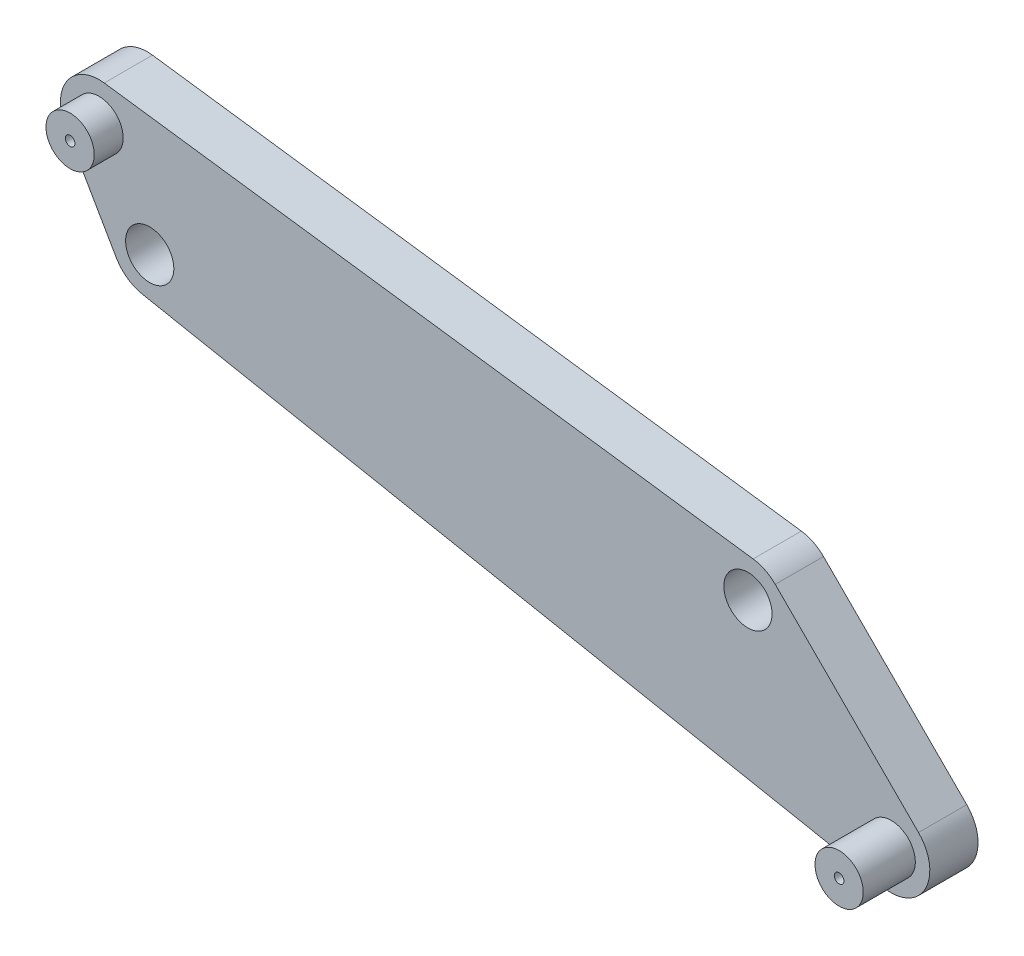
ISO-10303-21;
HEADER;
FILE_DESCRIPTION(('STEP AP214'),'2;1');
FILE_NAME('part.step','',(''),(''),'','','');
FILE_SCHEMA(('AUTOMOTIVE_DESIGN { 1 0 10303 214 1 1 1 1 }'));
ENDSEC;
DATA;
#1=APPLICATION_CONTEXT('core data for automotive mechanical design processes');
#2=APPLICATION_PROTOCOL_DEFINITION('international standard','automotive_design',2000,#1);
#3=PRODUCT_CONTEXT('',#1,'mechanical');
#4=PRODUCT('Part','Part','',(#3));
#5=PRODUCT_RELATED_PRODUCT_CATEGORY('part','',(#4));
#6=PRODUCT_DEFINITION_FORMATION('','',#4);
#7=PRODUCT_DEFINITION_CONTEXT('part definition',#1,'design');
#8=PRODUCT_DEFINITION('design','',#6,#7);
#9=PRODUCT_DEFINITION_SHAPE('','',#8);
#10=(LENGTH_UNIT() NAMED_UNIT(*) SI_UNIT(.MILLI.,.METRE.));
#11=(NAMED_UNIT(*) PLANE_ANGLE_UNIT() SI_UNIT($,.RADIAN.));
#12=(NAMED_UNIT(*) SI_UNIT($,.STERADIAN.) SOLID_ANGLE_UNIT());
#13=UNCERTAINTY_MEASURE_WITH_UNIT(LENGTH_MEASURE(1.E-05),#10,'distance_accuracy_value','');
#14=(GEOMETRIC_REPRESENTATION_CONTEXT(3) GLOBAL_UNCERTAINTY_ASSIGNED_CONTEXT((#13)) GLOBAL_UNIT_ASSIGNED_CONTEXT((#10,
#11,#12)) REPRESENTATION_CONTEXT('',''));
#15=CARTESIAN_POINT('',(0.,0.,0.));
#16=DIRECTION('',(0.,0.,1.));
#17=DIRECTION('',(1.,0.,0.));
#18=AXIS2_PLACEMENT_3D('',#15,#16,#17);
#19=CARTESIAN_POINT('',(-62.,0.,5.));
#20=DIRECTION('',(0.,0.,1.));
#21=DIRECTION('',(1.,0.,0.));
#22=AXIS2_PLACEMENT_3D('',#19,#20,#21);
#23=PLANE('',#22);
#24=CARTESIAN_POINT('',(0.,0.,5.));
#25=DIRECTION('',(0.,0.,1.));
#26=DIRECTION('',(1.,0.,0.));
#27=AXIS2_PLACEMENT_3D('',#24,#25,#26);
#28=CIRCLE('',#27,2.5);
#29=CARTESIAN_POINT('',(2.5,0.,5.));
#30=VERTEX_POINT('',#29);
#31=EDGE_CURVE('E188',#30,#30,#28,.T.);
#32=ORIENTED_EDGE('',*,*,#31,.F.);
#33=EDGE_LOOP('',(#32));
#34=FACE_BOUND('',#33,.T.);
#35=CARTESIAN_POINT('',(-62.,0.,5.));
#36=DIRECTION('',(0.,0.,1.));
#37=DIRECTION('',(1.,0.,0.));
#38=AXIS2_PLACEMENT_3D('',#35,#36,#37);
#39=CIRCLE('',#38,2.5);
#40=CARTESIAN_POINT('',(-59.5,0.,5.));
#41=VERTEX_POINT('',#40);
#42=EDGE_CURVE('E135',#41,#41,#39,.T.);
#43=ORIENTED_EDGE('',*,*,#42,.F.);
#44=EDGE_LOOP('',(#43));
#45=FACE_BOUND('',#44,.T.);
#46=CARTESIAN_POINT('',(-62.,0.,5.));
#47=DIRECTION('',(0.,0.,1.));
#48=DIRECTION('',(1.,0.,0.));
#49=AXIS2_PLACEMENT_3D('',#46,#47,#48);
#50=CIRCLE('',#49,3.99999999999999);
#51=CARTESIAN_POINT('',(-65.4641016151377,-1.99999999999999,5.));
#52=VERTEX_POINT('',#51);
#53=CARTESIAN_POINT('',(-62.7588657347675,-3.92735570028943,5.));
#54=VERTEX_POINT('',#53);
#55=EDGE_CURVE('E146',#52,#54,#50,.T.);
#56=ORIENTED_EDGE('',*,*,#55,.T.);
#57=DIRECTION('',(0.981838925072355,-0.189716433691869,0.));
#58=VECTOR('',#57,1.);
#59=CARTESIAN_POINT('',(14.0903766701501,-18.7765981052068,5.));
#60=LINE('',#59,#58);
#61=CARTESIAN_POINT('',(14.0903766701501,-18.7765981052068,5.));
#62=VERTEX_POINT('',#61);
#63=EDGE_CURVE('E94',#54,#62,#60,.T.);
#64=ORIENTED_EDGE('',*,*,#63,.T.);
#65=CARTESIAN_POINT('',(14.8492424049176,-14.8492424049174,5.));
#66=DIRECTION('',(0.,0.,1.));
#67=DIRECTION('',(1.,0.,0.));
#68=AXIS2_PLACEMENT_3D('',#65,#66,#67);
#69=CIRCLE('',#68,4.);
#70=CARTESIAN_POINT('',(17.6776695296638,-12.0208152801712,5.));
#71=VERTEX_POINT('',#70);
#72=EDGE_CURVE('E161',#62,#71,#69,.T.);
#73=ORIENTED_EDGE('',*,*,#72,.T.);
#74=DIRECTION('',(-0.707106781186551,0.707106781186543,0.));
#75=VECTOR('',#74,1.);
#76=CARTESIAN_POINT('',(2.82842712474617,2.82842712474621,5.));
#77=LINE('',#76,#75);
#78=CARTESIAN_POINT('',(2.82842712474617,2.82842712474621,5.));
#79=VERTEX_POINT('',#78);
#80=EDGE_CURVE('E174',#71,#79,#77,.T.);
#81=ORIENTED_EDGE('',*,*,#80,.T.);
#82=CARTESIAN_POINT('',(0.,0.,5.));
#83=DIRECTION('',(0.,0.,1.));
#84=DIRECTION('',(1.,0.,0.));
#85=AXIS2_PLACEMENT_3D('',#82,#83,#84);
#86=CIRCLE('',#85,4.);
#87=CARTESIAN_POINT('',(0.535985840113661,3.96392724191523,5.));
#88=VERTEX_POINT('',#87);
#89=EDGE_CURVE('E113',#79,#88,#86,.T.);
#90=ORIENTED_EDGE('',*,*,#89,.T.);
#91=DIRECTION('',(-0.990981810478807,0.133996460028415,0.));
#92=VECTOR('',#91,1.);
#93=CARTESIAN_POINT('',(-66.7140141598863,13.0571939816518,5.));
#94=LINE('',#93,#92);
#95=CARTESIAN_POINT('',(-66.7140141598863,13.0571939816518,5.));
#96=VERTEX_POINT('',#95);
#97=EDGE_CURVE('E107',#88,#96,#94,.T.);
#98=ORIENTED_EDGE('',*,*,#97,.T.);
#99=CARTESIAN_POINT('',(-67.25,9.09326673973662,5.));
#100=DIRECTION('',(0.,0.,1.));
#101=DIRECTION('',(1.,0.,0.));
#102=AXIS2_PLACEMENT_3D('',#99,#100,#101);
#103=CIRCLE('',#102,4.);
#104=CARTESIAN_POINT('',(-70.7141016151377,7.09326673973663,5.));
#105=VERTEX_POINT('',#104);
#106=EDGE_CURVE('E111',#96,#105,#103,.T.);
#107=ORIENTED_EDGE('',*,*,#106,.T.);
#108=DIRECTION('',(0.499999999999997,-0.866025403784441,0.));
#109=VECTOR('',#108,1.);
#110=CARTESIAN_POINT('',(-65.4641016151377,-1.99999999999999,5.));
#111=LINE('',#110,#109);
#112=EDGE_CURVE('E51',#105,#52,#111,.T.);
#113=ORIENTED_EDGE('',*,*,#112,.T.);
#114=EDGE_LOOP('',(#56,#64,#73,#81,#90,#98,#107,#113));
#115=FACE_BOUND('',#114,.T.);
#116=CARTESIAN_POINT('',(-67.25,9.09326673973662,5.));
#117=DIRECTION('',(0.,0.,1.));
#118=DIRECTION('',(1.,0.,0.));
#119=AXIS2_PLACEMENT_3D('',#116,#117,#118);
#120=CIRCLE('',#119,2.50000000000001);
#121=CARTESIAN_POINT('',(-64.7499999999999,9.09326673973662,5.));
#122=VERTEX_POINT('',#121);
#123=EDGE_CURVE('E183',#122,#122,#120,.T.);
#124=ORIENTED_EDGE('',*,*,#123,.F.);
#125=EDGE_LOOP('',(#124));
#126=FACE_BOUND('',#125,.T.);
#127=CARTESIAN_POINT('',(14.8492424049176,-14.8492424049174,5.));
#128=DIRECTION('',(0.,0.,1.));
#129=DIRECTION('',(1.,0.,0.));
#130=AXIS2_PLACEMENT_3D('',#127,#128,#129);
#131=CIRCLE('',#130,2.5);
#132=CARTESIAN_POINT('',(17.3492424049176,-14.8492424049174,5.));
#133=VERTEX_POINT('',#132);
#134=EDGE_CURVE('E192',#133,#133,#131,.T.);
#135=ORIENTED_EDGE('',*,*,#134,.F.);
#136=EDGE_LOOP('',(#135));
#137=FACE_BOUND('',#136,.T.);
#138=ADVANCED_FACE('F34',(#34,#45,#115,#126,#137),#23,.T.);
#139=CARTESIAN_POINT('',(-62.,0.,0.));
#140=DIRECTION('',(0.,0.,1.));
#141=DIRECTION('',(1.,0.,0.));
#142=AXIS2_PLACEMENT_3D('',#139,#140,#141);
#143=PLANE('',#142);
#144=CARTESIAN_POINT('',(-62.,0.,0.));
#145=DIRECTION('',(0.,0.,1.));
#146=DIRECTION('',(1.,0.,0.));
#147=AXIS2_PLACEMENT_3D('',#144,#145,#146);
#148=CIRCLE('',#147,3.99999999999999);
#149=CARTESIAN_POINT('',(-65.4641016151377,-1.99999999999999,0.));
#150=VERTEX_POINT('',#149);
#151=CARTESIAN_POINT('',(-62.7588657347675,-3.92735570028943,0.));
#152=VERTEX_POINT('',#151);
#153=EDGE_CURVE('E131',#150,#152,#148,.T.);
#154=ORIENTED_EDGE('',*,*,#153,.F.);
#155=DIRECTION('',(0.499999999999997,-0.866025403784441,0.));
#156=VECTOR('',#155,1.);
#157=CARTESIAN_POINT('',(-65.4641016151377,-1.99999999999999,0.));
#158=LINE('',#157,#156);
#159=CARTESIAN_POINT('',(-70.7141016151377,7.09326673973663,0.));
#160=VERTEX_POINT('',#159);
#161=EDGE_CURVE('E86',#160,#150,#158,.T.);
#162=ORIENTED_EDGE('',*,*,#161,.F.);
#163=CARTESIAN_POINT('',(-67.25,9.09326673973662,0.));
#164=DIRECTION('',(0.,0.,1.));
#165=DIRECTION('',(1.,0.,0.));
#166=AXIS2_PLACEMENT_3D('',#163,#164,#165);
#167=CIRCLE('',#166,4.);
#168=CARTESIAN_POINT('',(-66.7140141598863,13.0571939816518,0.));
#169=VERTEX_POINT('',#168);
#170=EDGE_CURVE('E80',#169,#160,#167,.T.);
#171=ORIENTED_EDGE('',*,*,#170,.F.);
#172=DIRECTION('',(-0.990981810478807,0.133996460028415,0.));
#173=VECTOR('',#172,1.);
#174=CARTESIAN_POINT('',(-66.7140141598863,13.0571939816518,0.));
#175=LINE('',#174,#173);
#176=CARTESIAN_POINT('',(0.535985840113661,3.96392724191523,0.));
#177=VERTEX_POINT('',#176);
#178=EDGE_CURVE('E121',#177,#169,#175,.T.);
#179=ORIENTED_EDGE('',*,*,#178,.F.);
#180=CARTESIAN_POINT('',(0.,0.,0.));
#181=DIRECTION('',(0.,0.,1.));
#182=DIRECTION('',(1.,0.,0.));
#183=AXIS2_PLACEMENT_3D('',#180,#181,#182);
#184=CIRCLE('',#183,4.);
#185=CARTESIAN_POINT('',(2.82842712474617,2.82842712474621,0.));
#186=VERTEX_POINT('',#185);
#187=EDGE_CURVE('E141',#186,#177,#184,.T.);
#188=ORIENTED_EDGE('',*,*,#187,.F.);
#189=DIRECTION('',(-0.707106781186551,0.707106781186543,0.));
#190=VECTOR('',#189,1.);
#191=CARTESIAN_POINT('',(2.82842712474617,2.82842712474621,0.));
#192=LINE('',#191,#190);
#193=CARTESIAN_POINT('',(17.6776695296638,-12.0208152801712,0.));
#194=VERTEX_POINT('',#193);
#195=EDGE_CURVE('E139',#194,#186,#192,.T.);
#196=ORIENTED_EDGE('',*,*,#195,.F.);
#197=CARTESIAN_POINT('',(14.8492424049176,-14.8492424049174,0.));
#198=DIRECTION('',(0.,0.,1.));
#199=DIRECTION('',(1.,0.,0.));
#200=AXIS2_PLACEMENT_3D('',#197,#198,#199);
#201=CIRCLE('',#200,4.);
#202=CARTESIAN_POINT('',(14.0903766701501,-18.7765981052068,0.));
#203=VERTEX_POINT('',#202);
#204=EDGE_CURVE('E137',#203,#194,#201,.T.);
#205=ORIENTED_EDGE('',*,*,#204,.F.);
#206=DIRECTION('',(0.981838925072355,-0.189716433691869,0.));
#207=VECTOR('',#206,1.);
#208=CARTESIAN_POINT('',(14.0903766701501,-18.7765981052068,0.));
#209=LINE('',#208,#207);
#210=EDGE_CURVE('E134',#152,#203,#209,.T.);
#211=ORIENTED_EDGE('',*,*,#210,.F.);
#212=EDGE_LOOP('',(#154,#162,#171,#179,#188,#196,#205,#211));
#213=FACE_BOUND('',#212,.T.);
#214=CARTESIAN_POINT('',(-62.,0.,0.));
#215=DIRECTION('',(0.,0.,1.));
#216=DIRECTION('',(1.,0.,0.));
#217=AXIS2_PLACEMENT_3D('',#214,#215,#216);
#218=CIRCLE('',#217,2.5);
#219=CARTESIAN_POINT('',(-59.5,0.,0.));
#220=VERTEX_POINT('',#219);
#221=EDGE_CURVE('E180',#220,#220,#218,.T.);
#222=ORIENTED_EDGE('',*,*,#221,.T.);
#223=EDGE_LOOP('',(#222));
#224=FACE_BOUND('',#223,.T.);
#225=CARTESIAN_POINT('',(0.,0.,0.));
#226=DIRECTION('',(0.,0.,1.));
#227=DIRECTION('',(1.,0.,0.));
#228=AXIS2_PLACEMENT_3D('',#225,#226,#227);
#229=CIRCLE('',#228,2.5);
#230=CARTESIAN_POINT('',(2.5,0.,0.));
#231=VERTEX_POINT('',#230);
#232=EDGE_CURVE('E189',#231,#231,#229,.T.);
#233=ORIENTED_EDGE('',*,*,#232,.T.);
#234=EDGE_LOOP('',(#233));
#235=FACE_BOUND('',#234,.T.);
#236=CARTESIAN_POINT('',(-67.25,9.09326673973662,0.));
#237=DIRECTION('',(0.,0.,-1.));
#238=DIRECTION('',(-1.,0.,0.));
#239=AXIS2_PLACEMENT_3D('',#236,#237,#238);
#240=CIRCLE('',#239,0.499999999999999);
#241=CARTESIAN_POINT('',(-67.75,9.09326673973662,0.));
#242=VERTEX_POINT('',#241);
#243=EDGE_CURVE('E201',#242,#242,#240,.T.);
#244=ORIENTED_EDGE('',*,*,#243,.F.);
#245=EDGE_LOOP('',(#244));
#246=FACE_BOUND('',#245,.T.);
#247=CARTESIAN_POINT('',(14.8492424049176,-14.8492424049174,0.));
#248=DIRECTION('',(0.,0.,-1.));
#249=DIRECTION('',(-1.,0.,0.));
#250=AXIS2_PLACEMENT_3D('',#247,#248,#249);
#251=CIRCLE('',#250,0.500000000000001);
#252=CARTESIAN_POINT('',(14.3492424049176,-14.8492424049174,0.));
#253=VERTEX_POINT('',#252);
#254=EDGE_CURVE('E204',#253,#253,#251,.T.);
#255=ORIENTED_EDGE('',*,*,#254,.F.);
#256=EDGE_LOOP('',(#255));
#257=FACE_BOUND('',#256,.T.);
#258=ADVANCED_FACE('F165',(#213,#224,#235,#246,#257),#143,.F.);
#259=CARTESIAN_POINT('',(-62.,0.,5.));
#260=DIRECTION('',(0.,0.,-1.));
#261=DIRECTION('',(-1.,0.,0.));
#262=AXIS2_PLACEMENT_3D('',#259,#260,#261);
#263=CYLINDRICAL_SURFACE('',#262,3.99999999999999);
#264=ORIENTED_EDGE('',*,*,#153,.T.);
#265=DIRECTION('',(0.,0.,-1.));
#266=VECTOR('',#265,1.);
#267=CARTESIAN_POINT('',(-62.7588657347675,-3.92735570028943,5.));
#268=LINE('',#267,#266);
#269=EDGE_CURVE('E11',#54,#152,#268,.T.);
#270=ORIENTED_EDGE('',*,*,#269,.F.);
#271=ORIENTED_EDGE('',*,*,#55,.F.);
#272=DIRECTION('',(0.,0.,-1.));
#273=VECTOR('',#272,1.);
#274=CARTESIAN_POINT('',(-65.4641016151377,-1.99999999999999,5.));
#275=LINE('',#274,#273);
#276=EDGE_CURVE('E127',#52,#150,#275,.T.);
#277=ORIENTED_EDGE('',*,*,#276,.T.);
#278=EDGE_LOOP('',(#264,#270,#271,#277));
#279=FACE_BOUND('',#278,.T.);
#280=ADVANCED_FACE('F36',(#279),#263,.T.);
#281=CARTESIAN_POINT('',(14.0903766701501,-18.7765981052068,5.));
#282=DIRECTION('',(0.189716433691869,0.981838925072355,0.));
#283=DIRECTION('',(-0.981838925072356,0.189716433691869,0.));
#284=AXIS2_PLACEMENT_3D('',#281,#282,#283);
#285=PLANE('',#284);
#286=ORIENTED_EDGE('',*,*,#210,.T.);
#287=DIRECTION('',(0.,0.,-1.));
#288=VECTOR('',#287,1.);
#289=CARTESIAN_POINT('',(14.0903766701501,-18.7765981052068,5.));
#290=LINE('',#289,#288);
#291=EDGE_CURVE('E43',#62,#203,#290,.T.);
#292=ORIENTED_EDGE('',*,*,#291,.F.);
#293=ORIENTED_EDGE('',*,*,#63,.F.);
#294=ORIENTED_EDGE('',*,*,#269,.T.);
#295=EDGE_LOOP('',(#286,#292,#293,#294));
#296=FACE_BOUND('',#295,.T.);
#297=ADVANCED_FACE('F253',(#296),#285,.F.);
#298=CARTESIAN_POINT('',(14.8492424049176,-14.8492424049174,5.));
#299=DIRECTION('',(0.,0.,-1.));
#300=DIRECTION('',(-1.,0.,0.));
#301=AXIS2_PLACEMENT_3D('',#298,#299,#300);
#302=CYLINDRICAL_SURFACE('',#301,4.);
#303=ORIENTED_EDGE('',*,*,#204,.T.);
#304=DIRECTION('',(0.,0.,-1.));
#305=VECTOR('',#304,1.);
#306=CARTESIAN_POINT('',(17.6776695296638,-12.0208152801712,5.));
#307=LINE('',#306,#305);
#308=EDGE_CURVE('E153',#71,#194,#307,.T.);
#309=ORIENTED_EDGE('',*,*,#308,.F.);
#310=ORIENTED_EDGE('',*,*,#72,.F.);
#311=ORIENTED_EDGE('',*,*,#291,.T.);
#312=EDGE_LOOP('',(#303,#309,#310,#311));
#313=FACE_BOUND('',#312,.T.);
#314=ADVANCED_FACE('F159',(#313),#302,.T.);
#315=CARTESIAN_POINT('',(2.82842712474617,2.82842712474621,5.));
#316=DIRECTION('',(-0.707106781186544,-0.707106781186551,0.));
#317=DIRECTION('',(0.707106781186551,-0.707106781186544,0.));
#318=AXIS2_PLACEMENT_3D('',#315,#316,#317);
#319=PLANE('',#318);
#320=ORIENTED_EDGE('',*,*,#195,.T.);
#321=DIRECTION('',(0.,0.,-1.));
#322=VECTOR('',#321,1.);
#323=CARTESIAN_POINT('',(2.82842712474617,2.82842712474621,5.));
#324=LINE('',#323,#322);
#325=EDGE_CURVE('E150',#79,#186,#324,.T.);
#326=ORIENTED_EDGE('',*,*,#325,.F.);
#327=ORIENTED_EDGE('',*,*,#80,.F.);
#328=ORIENTED_EDGE('',*,*,#308,.T.);
#329=EDGE_LOOP('',(#320,#326,#327,#328));
#330=FACE_BOUND('',#329,.T.);
#331=ADVANCED_FACE('F170',(#330),#319,.F.);
#332=CARTESIAN_POINT('',(0.,0.,5.));
#333=DIRECTION('',(0.,0.,-1.));
#334=DIRECTION('',(-1.,0.,0.));
#335=AXIS2_PLACEMENT_3D('',#332,#333,#334);
#336=CYLINDRICAL_SURFACE('',#335,4.);
#337=ORIENTED_EDGE('',*,*,#187,.T.);
#338=DIRECTION('',(0.,0.,-1.));
#339=VECTOR('',#338,1.);
#340=CARTESIAN_POINT('',(0.535985840113661,3.96392724191523,5.));
#341=LINE('',#340,#339);
#342=EDGE_CURVE('E122',#88,#177,#341,.T.);
#343=ORIENTED_EDGE('',*,*,#342,.F.);
#344=ORIENTED_EDGE('',*,*,#89,.F.);
#345=ORIENTED_EDGE('',*,*,#325,.T.);
#346=EDGE_LOOP('',(#337,#343,#344,#345));
#347=FACE_BOUND('',#346,.T.);
#348=ADVANCED_FACE('F173',(#347),#336,.T.);
#349=CARTESIAN_POINT('',(-66.7140141598863,13.0571939816518,5.));
#350=DIRECTION('',(-0.133996460028415,-0.990981810478807,0.));
#351=DIRECTION('',(0.990981810478807,-0.133996460028415,0.));
#352=AXIS2_PLACEMENT_3D('',#349,#350,#351);
#353=PLANE('',#352);
#354=ORIENTED_EDGE('',*,*,#178,.T.);
#355=DIRECTION('',(0.,0.,-1.));
#356=VECTOR('',#355,1.);
#357=CARTESIAN_POINT('',(-66.7140141598863,13.0571939816518,5.));
#358=LINE('',#357,#356);
#359=EDGE_CURVE('E118',#96,#169,#358,.T.);
#360=ORIENTED_EDGE('',*,*,#359,.F.);
#361=ORIENTED_EDGE('',*,*,#97,.F.);
#362=ORIENTED_EDGE('',*,*,#342,.T.);
#363=EDGE_LOOP('',(#354,#360,#361,#362));
#364=FACE_BOUND('',#363,.T.);
#365=ADVANCED_FACE('F119',(#364),#353,.F.);
#366=CARTESIAN_POINT('',(-67.25,9.09326673973662,5.));
#367=DIRECTION('',(0.,0.,-1.));
#368=DIRECTION('',(-1.,0.,0.));
#369=AXIS2_PLACEMENT_3D('',#366,#367,#368);
#370=CYLINDRICAL_SURFACE('',#369,4.);
#371=ORIENTED_EDGE('',*,*,#170,.T.);
#372=DIRECTION('',(0.,0.,-1.));
#373=VECTOR('',#372,1.);
#374=CARTESIAN_POINT('',(-70.7141016151377,7.09326673973663,5.));
#375=LINE('',#374,#373);
#376=EDGE_CURVE('E123',#105,#160,#375,.T.);
#377=ORIENTED_EDGE('',*,*,#376,.F.);
#378=ORIENTED_EDGE('',*,*,#106,.F.);
#379=ORIENTED_EDGE('',*,*,#359,.T.);
#380=EDGE_LOOP('',(#371,#377,#378,#379));
#381=FACE_BOUND('',#380,.T.);
#382=ADVANCED_FACE('F125',(#381),#370,.T.);
#383=CARTESIAN_POINT('',(-65.4641016151377,-1.99999999999999,5.));
#384=DIRECTION('',(0.866025403784441,0.499999999999997,0.));
#385=DIRECTION('',(-0.499999999999997,0.866025403784441,0.));
#386=AXIS2_PLACEMENT_3D('',#383,#384,#385);
#387=PLANE('',#386);
#388=ORIENTED_EDGE('',*,*,#161,.T.);
#389=ORIENTED_EDGE('',*,*,#276,.F.);
#390=ORIENTED_EDGE('',*,*,#112,.F.);
#391=ORIENTED_EDGE('',*,*,#376,.T.);
#392=EDGE_LOOP('',(#388,#389,#390,#391));
#393=FACE_BOUND('',#392,.T.);
#394=ADVANCED_FACE('F241',(#393),#387,.F.);
#395=CARTESIAN_POINT('',(-62.,0.,5.));
#396=DIRECTION('',(0.,0.,-1.));
#397=DIRECTION('',(-1.,0.,0.));
#398=AXIS2_PLACEMENT_3D('',#395,#396,#397);
#399=CYLINDRICAL_SURFACE('',#398,2.5);
#400=ORIENTED_EDGE('',*,*,#42,.T.);
#401=EDGE_LOOP('',(#400));
#402=FACE_BOUND('',#401,.T.);
#403=ORIENTED_EDGE('',*,*,#221,.F.);
#404=EDGE_LOOP('',(#403));
#405=FACE_BOUND('',#404,.T.);
#406=ADVANCED_FACE('F238',(#402,#405),#399,.F.);
#407=CARTESIAN_POINT('',(0.,0.,5.));
#408=DIRECTION('',(0.,0.,-1.));
#409=DIRECTION('',(-1.,0.,0.));
#410=AXIS2_PLACEMENT_3D('',#407,#408,#409);
#411=CYLINDRICAL_SURFACE('',#410,2.5);
#412=ORIENTED_EDGE('',*,*,#31,.T.);
#413=EDGE_LOOP('',(#412));
#414=FACE_BOUND('',#413,.T.);
#415=ORIENTED_EDGE('',*,*,#232,.F.);
#416=EDGE_LOOP('',(#415));
#417=FACE_BOUND('',#416,.T.);
#418=ADVANCED_FACE('F275',(#414,#417),#411,.F.);
#419=CARTESIAN_POINT('',(-67.25,9.09326673973662,8.));
#420=DIRECTION('',(0.,0.,-1.));
#421=DIRECTION('',(-1.,0.,0.));
#422=AXIS2_PLACEMENT_3D('',#419,#420,#421);
#423=CYLINDRICAL_SURFACE('',#422,2.50000000000001);
#424=ORIENTED_EDGE('',*,*,#123,.T.);
#425=EDGE_LOOP('',(#424));
#426=FACE_BOUND('',#425,.T.);
#427=CARTESIAN_POINT('',(-67.25,9.09326673973662,8.));
#428=DIRECTION('',(0.,0.,-1.));
#429=DIRECTION('',(-1.,0.,0.));
#430=AXIS2_PLACEMENT_3D('',#427,#428,#429);
#431=CIRCLE('',#430,2.50000000000001);
#432=CARTESIAN_POINT('',(-69.75,9.09326673973662,8.));
#433=VERTEX_POINT('',#432);
#434=EDGE_CURVE('E197',#433,#433,#431,.T.);
#435=ORIENTED_EDGE('',*,*,#434,.T.);
#436=EDGE_LOOP('',(#435));
#437=FACE_BOUND('',#436,.T.);
#438=ADVANCED_FACE('F280',(#426,#437),#423,.T.);
#439=CARTESIAN_POINT('',(-67.25,9.09326673973662,8.));
#440=DIRECTION('',(0.,0.,-1.));
#441=DIRECTION('',(-1.,0.,0.));
#442=AXIS2_PLACEMENT_3D('',#439,#440,#441);
#443=PLANE('',#442);
#444=CARTESIAN_POINT('',(-67.25,9.09326673973662,8.));
#445=DIRECTION('',(0.,0.,-1.));
#446=DIRECTION('',(-1.,0.,0.));
#447=AXIS2_PLACEMENT_3D('',#444,#445,#446);
#448=CIRCLE('',#447,0.499999999999999);
#449=CARTESIAN_POINT('',(-67.75,9.09326673973662,8.));
#450=VERTEX_POINT('',#449);
#451=EDGE_CURVE('E200',#450,#450,#448,.T.);
#452=ORIENTED_EDGE('',*,*,#451,.T.);
#453=EDGE_LOOP('',(#452));
#454=FACE_BOUND('',#453,.T.);
#455=ORIENTED_EDGE('',*,*,#434,.F.);
#456=EDGE_LOOP('',(#455));
#457=FACE_BOUND('',#456,.T.);
#458=ADVANCED_FACE('F284',(#454,#457),#443,.F.);
#459=CARTESIAN_POINT('',(-67.25,9.09326673973662,8.));
#460=DIRECTION('',(0.,0.,-1.));
#461=DIRECTION('',(-1.,0.,0.));
#462=AXIS2_PLACEMENT_3D('',#459,#460,#461);
#463=CYLINDRICAL_SURFACE('',#462,0.499999999999999);
#464=ORIENTED_EDGE('',*,*,#451,.F.);
#465=EDGE_LOOP('',(#464));
#466=FACE_BOUND('',#465,.T.);
#467=ORIENTED_EDGE('',*,*,#243,.T.);
#468=EDGE_LOOP('',(#467));
#469=FACE_BOUND('',#468,.T.);
#470=ADVANCED_FACE('F294',(#466,#469),#463,.F.);
#471=CARTESIAN_POINT('',(14.8492424049176,-14.8492424049174,8.));
#472=DIRECTION('',(0.,0.,-1.));
#473=DIRECTION('',(-1.,0.,0.));
#474=AXIS2_PLACEMENT_3D('',#471,#472,#473);
#475=CYLINDRICAL_SURFACE('',#474,2.5);
#476=ORIENTED_EDGE('',*,*,#134,.T.);
#477=EDGE_LOOP('',(#476));
#478=FACE_BOUND('',#477,.T.);
#479=CARTESIAN_POINT('',(14.8492424049176,-14.8492424049174,10.4));
#480=DIRECTION('',(0.,0.,1.));
#481=DIRECTION('',(1.,0.,0.));
#482=AXIS2_PLACEMENT_3D('',#479,#480,#481);
#483=CIRCLE('',#482,2.5);
#484=CARTESIAN_POINT('',(17.3492424049176,-14.8492424049174,10.4));
#485=VERTEX_POINT('',#484);
#486=EDGE_CURVE('E209',#485,#485,#483,.T.);
#487=ORIENTED_EDGE('',*,*,#486,.F.);
#488=EDGE_LOOP('',(#487));
#489=FACE_BOUND('',#488,.T.);
#490=ADVANCED_FACE('F225',(#478,#489),#475,.T.);
#491=CARTESIAN_POINT('',(14.8492424049176,-14.8492424049174,8.));
#492=DIRECTION('',(0.,0.,-1.));
#493=DIRECTION('',(-1.,0.,0.));
#494=AXIS2_PLACEMENT_3D('',#491,#492,#493);
#495=CYLINDRICAL_SURFACE('',#494,0.500000000000001);
#496=ORIENTED_EDGE('',*,*,#254,.T.);
#497=EDGE_LOOP('',(#496));
#498=FACE_BOUND('',#497,.T.);
#499=CARTESIAN_POINT('',(14.8492424049176,-14.8492424049174,10.4));
#500=DIRECTION('',(0.,0.,1.));
#501=DIRECTION('',(1.,0.,0.));
#502=AXIS2_PLACEMENT_3D('',#499,#500,#501);
#503=CIRCLE('',#502,0.500000000000001);
#504=CARTESIAN_POINT('',(15.3492424049176,-14.8492424049174,10.4));
#505=VERTEX_POINT('',#504);
#506=EDGE_CURVE('E212',#505,#505,#503,.T.);
#507=ORIENTED_EDGE('',*,*,#506,.T.);
#508=EDGE_LOOP('',(#507));
#509=FACE_BOUND('',#508,.T.);
#510=ADVANCED_FACE('F216',(#498,#509),#495,.F.);
#511=CARTESIAN_POINT('',(14.8492424049176,-14.8492424049174,10.4));
#512=DIRECTION('',(0.,0.,1.));
#513=DIRECTION('',(1.,0.,0.));
#514=AXIS2_PLACEMENT_3D('',#511,#512,#513);
#515=PLANE('',#514);
#516=ORIENTED_EDGE('',*,*,#486,.T.);
#517=EDGE_LOOP('',(#516));
#518=FACE_BOUND('',#517,.T.);
#519=ORIENTED_EDGE('',*,*,#506,.F.);
#520=EDGE_LOOP('',(#519));
#521=FACE_BOUND('',#520,.T.);
#522=ADVANCED_FACE('F218',(#518,#521),#515,.T.);
#523=CLOSED_SHELL('',(#138,#258,#280,#297,#314,#331,#348,#365,#382,#394,#406,#418,#438,#458,
#470,#490,#510,#522));
#524=MANIFOLD_SOLID_BREP('B2',#523);
#525=ADVANCED_BREP_SHAPE_REPRESENTATION('',(#18,#524),#14);
#526=SHAPE_DEFINITION_REPRESENTATION(#9,#525);
ENDSEC;
END-ISO-10303-21;
